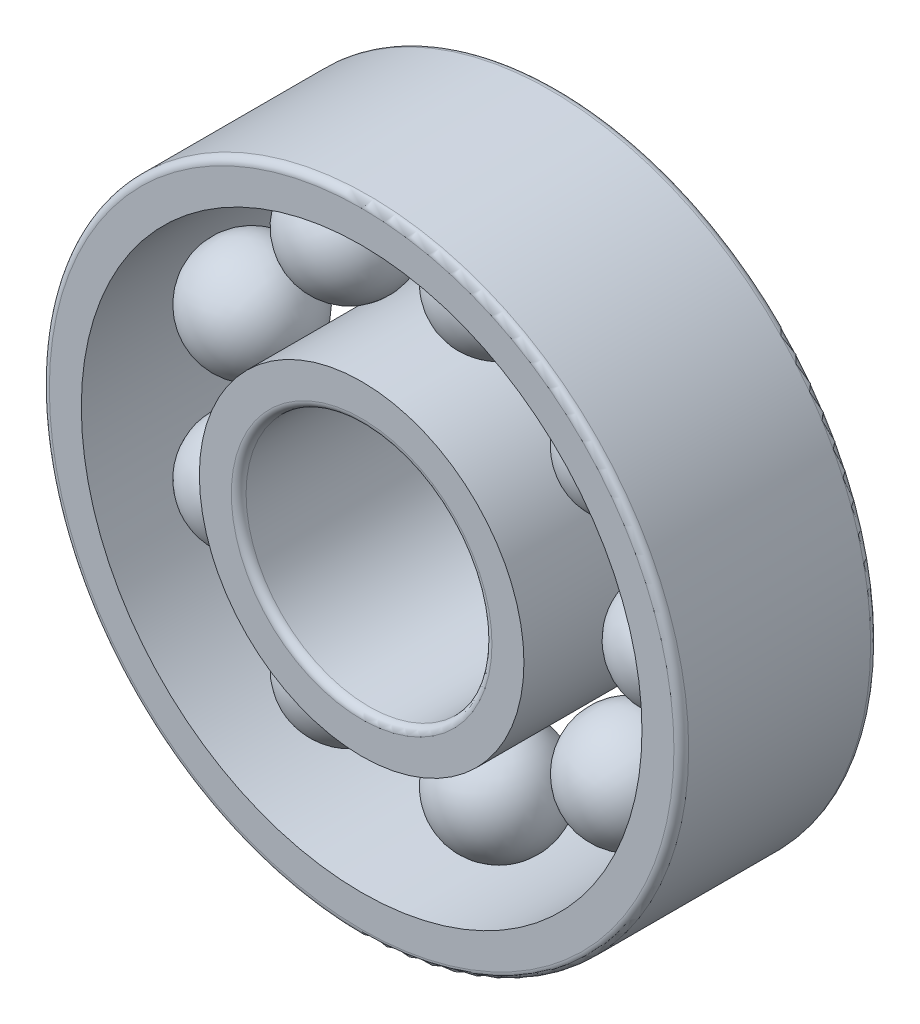
ISO-10303-21;
HEADER;
FILE_DESCRIPTION(('STEP AP214'),'2;1');
FILE_NAME('part.step','',(''),(''),'','','');
FILE_SCHEMA(('AUTOMOTIVE_DESIGN { 1 0 10303 214 1 1 1 1 }'));
ENDSEC;
DATA;
#1=APPLICATION_CONTEXT('core data for automotive mechanical design processes');
#2=APPLICATION_PROTOCOL_DEFINITION('international standard','automotive_design',2000,#1);
#3=PRODUCT_CONTEXT('',#1,'mechanical');
#4=PRODUCT('Part','Part','',(#3));
#5=PRODUCT_RELATED_PRODUCT_CATEGORY('part','',(#4));
#6=PRODUCT_DEFINITION_FORMATION('','',#4);
#7=PRODUCT_DEFINITION_CONTEXT('part definition',#1,'design');
#8=PRODUCT_DEFINITION('design','',#6,#7);
#9=PRODUCT_DEFINITION_SHAPE('','',#8);
#10=(LENGTH_UNIT() NAMED_UNIT(*) SI_UNIT(.MILLI.,.METRE.));
#11=(NAMED_UNIT(*) PLANE_ANGLE_UNIT() SI_UNIT($,.RADIAN.));
#12=(NAMED_UNIT(*) SI_UNIT($,.STERADIAN.) SOLID_ANGLE_UNIT());
#13=UNCERTAINTY_MEASURE_WITH_UNIT(LENGTH_MEASURE(1.E-05),#10,'distance_accuracy_value','');
#14=(GEOMETRIC_REPRESENTATION_CONTEXT(3) GLOBAL_UNCERTAINTY_ASSIGNED_CONTEXT((#13)) GLOBAL_UNIT_ASSIGNED_CONTEXT((#10,
#11,#12)) REPRESENTATION_CONTEXT('',''));
#15=CARTESIAN_POINT('',(0.,0.,0.));
#16=DIRECTION('',(0.,0.,1.));
#17=DIRECTION('',(1.,0.,0.));
#18=AXIS2_PLACEMENT_3D('',#15,#16,#17);
#19=CARTESIAN_POINT('',(6.8943999880708,-5.78508848717886,0.));
#20=DIRECTION('',(-0.766044443118978,0.64278760968654,0.));
#21=DIRECTION('',(0.,0.,-1.));
#22=AXIS2_PLACEMENT_3D('',#19,#20,#21);
#23=SPHERICAL_SURFACE('',#22,2.28);
#24=CARTESIAN_POINT('',(5.14781865775953,-4.31953273709355,0.));
#25=VERTEX_POINT('',#24);
#26=VERTEX_LOOP('',#25);
#27=FACE_BOUND('',#26,.T.);
#28=ADVANCED_FACE('F38',(#27),#23,.T.);
#29=CLOSED_SHELL('',(#28));
#30=MANIFOLD_SOLID_BREP('B2',#29);
#31=CARTESIAN_POINT('',(1.56283359900237,-8.86326977710987,0.));
#32=DIRECTION('',(-0.17364817766693,0.984807753012208,0.));
#33=DIRECTION('',(0.,0.,-1.));
#34=AXIS2_PLACEMENT_3D('',#31,#32,#33);
#35=SPHERICAL_SURFACE('',#34,2.28);
#36=CARTESIAN_POINT('',(1.16691575392177,-6.61790810024204,0.));
#37=VERTEX_POINT('',#36);
#38=VERTEX_LOOP('',#37);
#39=FACE_BOUND('',#38,.T.);
#40=ADVANCED_FACE('F57',(#39),#35,.T.);
#41=CLOSED_SHELL('',(#40));
#42=MANIFOLD_SOLID_BREP('B6',#41);
#43=CARTESIAN_POINT('',(-4.5,-7.79422863405995,0.));
#44=DIRECTION('',(0.5,0.866025403784438,0.));
#45=DIRECTION('',(0.,0.,-1.));
#46=AXIS2_PLACEMENT_3D('',#43,#44,#45);
#47=SPHERICAL_SURFACE('',#46,2.28);
#48=CARTESIAN_POINT('',(-3.36,-5.81969071343143,0.));
#49=VERTEX_POINT('',#48);
#50=VERTEX_LOOP('',#49);
#51=FACE_BOUND('',#50,.T.);
#52=ADVANCED_FACE('F76',(#51),#47,.T.);
#53=CLOSED_SHELL('',(#52));
#54=MANIFOLD_SOLID_BREP('B34',#53);
#55=CARTESIAN_POINT('',(-8.45723358707318,-3.07818128993102,0.));
#56=DIRECTION('',(0.939692620785908,0.342020143325669,0.));
#57=DIRECTION('',(0.,0.,-1.));
#58=AXIS2_PLACEMENT_3D('',#55,#56,#57);
#59=SPHERICAL_SURFACE('',#58,2.28);
#60=CARTESIAN_POINT('',(-6.3147344116813,-2.29837536314849,0.));
#61=VERTEX_POINT('',#60);
#62=VERTEX_LOOP('',#61);
#63=FACE_BOUND('',#62,.T.);
#64=ADVANCED_FACE('F95',(#63),#59,.T.);
#65=CLOSED_SHELL('',(#64));
#66=MANIFOLD_SOLID_BREP('B53',#65);
#67=CARTESIAN_POINT('',(-8.45723358707318,3.07818128993102,0.));
#68=DIRECTION('',(0.939692620785909,-0.342020143325669,0.));
#69=DIRECTION('',(0.,0.,-1.));
#70=AXIS2_PLACEMENT_3D('',#67,#68,#69);
#71=SPHERICAL_SURFACE('',#70,2.28);
#72=CARTESIAN_POINT('',(-6.31473441168131,2.2983753631485,0.));
#73=VERTEX_POINT('',#72);
#74=VERTEX_LOOP('',#73);
#75=FACE_BOUND('',#74,.T.);
#76=ADVANCED_FACE('F114',(#75),#71,.T.);
#77=CLOSED_SHELL('',(#76));
#78=MANIFOLD_SOLID_BREP('B72',#77);
#79=CARTESIAN_POINT('',(-4.5,7.79422863405995,0.));
#80=DIRECTION('',(0.5,-0.866025403784439,0.));
#81=DIRECTION('',(0.,0.,-1.));
#82=AXIS2_PLACEMENT_3D('',#79,#80,#81);
#83=SPHERICAL_SURFACE('',#82,2.28);
#84=CARTESIAN_POINT('',(-3.36,5.81969071343143,0.));
#85=VERTEX_POINT('',#84);
#86=VERTEX_LOOP('',#85);
#87=FACE_BOUND('',#86,.T.);
#88=ADVANCED_FACE('F133',(#87),#83,.T.);
#89=CLOSED_SHELL('',(#88));
#90=MANIFOLD_SOLID_BREP('B91',#89);
#91=CARTESIAN_POINT('',(1.56283359900237,8.86326977710987,0.));
#92=DIRECTION('',(-0.17364817766693,-0.984807753012208,0.));
#93=DIRECTION('',(0.,0.,-1.));
#94=AXIS2_PLACEMENT_3D('',#91,#92,#93);
#95=SPHERICAL_SURFACE('',#94,2.28);
#96=CARTESIAN_POINT('',(1.16691575392177,6.61790810024204,0.));
#97=VERTEX_POINT('',#96);
#98=VERTEX_LOOP('',#97);
#99=FACE_BOUND('',#98,.T.);
#100=ADVANCED_FACE('F152',(#99),#95,.T.);
#101=CLOSED_SHELL('',(#100));
#102=MANIFOLD_SOLID_BREP('B110',#101);
#103=CARTESIAN_POINT('',(6.8943999880708,5.78508848717886,0.));
#104=DIRECTION('',(-0.766044443118978,-0.642787609686539,0.));
#105=DIRECTION('',(0.,0.,-1.));
#106=AXIS2_PLACEMENT_3D('',#103,#104,#105);
#107=SPHERICAL_SURFACE('',#106,2.28);
#108=CARTESIAN_POINT('',(5.14781865775953,4.31953273709355,0.));
#109=VERTEX_POINT('',#108);
#110=VERTEX_LOOP('',#109);
#111=FACE_BOUND('',#110,.T.);
#112=ADVANCED_FACE('F171',(#111),#107,.T.);
#113=CLOSED_SHELL('',(#112));
#114=MANIFOLD_SOLID_BREP('B129',#113);
#115=CARTESIAN_POINT('',(9.,0.,0.));
#116=DIRECTION('',(-1.,0.,0.));
#117=DIRECTION('',(0.,0.,-1.));
#118=AXIS2_PLACEMENT_3D('',#115,#116,#117);
#119=SPHERICAL_SURFACE('',#118,2.28);
#120=CARTESIAN_POINT('',(6.72,0.,0.));
#121=VERTEX_POINT('',#120);
#122=VERTEX_LOOP('',#121);
#123=FACE_BOUND('',#122,.T.);
#124=ADVANCED_FACE('F192',(#123),#119,.T.);
#125=CLOSED_SHELL('',(#124));
#126=MANIFOLD_SOLID_BREP('B148',#125);
#127=CARTESIAN_POINT('',(0.,0.,7.));
#128=DIRECTION('',(0.,0.,1.));
#129=DIRECTION('',(1.,0.,0.));
#130=AXIS2_PLACEMENT_3D('',#127,#128,#129);
#131=CYLINDRICAL_SURFACE('',#130,11.4);
#132=CARTESIAN_POINT('',(0.,0.,4.));
#133=DIRECTION('',(0.,0.,1.));
#134=DIRECTION('',(1.,0.,0.));
#135=AXIS2_PLACEMENT_3D('',#132,#133,#134);
#136=CIRCLE('',#135,11.4);
#137=CARTESIAN_POINT('',(11.4,0.,4.));
#138=VERTEX_POINT('',#137);
#139=EDGE_CURVE('E232',#138,#138,#136,.T.);
#140=ORIENTED_EDGE('',*,*,#139,.T.);
#141=EDGE_LOOP('',(#140));
#142=FACE_BOUND('',#141,.T.);
#143=CARTESIAN_POINT('',(0.,0.,-4.));
#144=DIRECTION('',(0.,0.,1.));
#145=DIRECTION('',(1.,0.,0.));
#146=AXIS2_PLACEMENT_3D('',#143,#144,#145);
#147=CIRCLE('',#146,11.4);
#148=CARTESIAN_POINT('',(11.4,0.,-4.));
#149=VERTEX_POINT('',#148);
#150=EDGE_CURVE('E235',#149,#149,#147,.T.);
#151=ORIENTED_EDGE('',*,*,#150,.F.);
#152=EDGE_LOOP('',(#151));
#153=FACE_BOUND('',#152,.T.);
#154=ADVANCED_FACE('F212',(#142,#153),#131,.F.);
#155=CARTESIAN_POINT('',(11.4,0.,4.));
#156=DIRECTION('',(0.,0.,1.));
#157=DIRECTION('',(1.,0.,0.));
#158=AXIS2_PLACEMENT_3D('',#155,#156,#157);
#159=PLANE('',#158);
#160=CARTESIAN_POINT('',(0.,0.,4.));
#161=DIRECTION('',(0.,0.,1.));
#162=DIRECTION('',(1.,0.,0.));
#163=AXIS2_PLACEMENT_3D('',#160,#161,#162);
#164=CIRCLE('',#163,12.7);
#165=CARTESIAN_POINT('',(12.7,0.,4.));
#166=VERTEX_POINT('',#165);
#167=EDGE_CURVE('E191',#166,#166,#164,.T.);
#168=ORIENTED_EDGE('',*,*,#167,.T.);
#169=EDGE_LOOP('',(#168));
#170=FACE_BOUND('',#169,.T.);
#171=ORIENTED_EDGE('',*,*,#139,.F.);
#172=EDGE_LOOP('',(#171));
#173=FACE_BOUND('',#172,.T.);
#174=ADVANCED_FACE('F242',(#170,#173),#159,.T.);
#175=CARTESIAN_POINT('',(0.,0.,7.));
#176=DIRECTION('',(0.,0.,1.));
#177=DIRECTION('',(1.,0.,0.));
#178=AXIS2_PLACEMENT_3D('',#175,#176,#177);
#179=CYLINDRICAL_SURFACE('',#178,13.);
#180=CARTESIAN_POINT('',(0.,0.,-3.7));
#181=DIRECTION('',(0.,0.,-1.));
#182=DIRECTION('',(-1.,0.,0.));
#183=AXIS2_PLACEMENT_3D('',#180,#181,#182);
#184=CIRCLE('',#183,13.);
#185=CARTESIAN_POINT('',(-13.,0.,-3.7));
#186=VERTEX_POINT('',#185);
#187=EDGE_CURVE('E223',#186,#186,#184,.F.);
#188=ORIENTED_EDGE('',*,*,#187,.T.);
#189=EDGE_LOOP('',(#188));
#190=FACE_BOUND('',#189,.T.);
#191=CARTESIAN_POINT('',(0.,0.,3.7));
#192=DIRECTION('',(0.,0.,1.));
#193=DIRECTION('',(1.,0.,0.));
#194=AXIS2_PLACEMENT_3D('',#191,#192,#193);
#195=CIRCLE('',#194,13.);
#196=CARTESIAN_POINT('',(13.,0.,3.7));
#197=VERTEX_POINT('',#196);
#198=EDGE_CURVE('E227',#197,#197,#195,.F.);
#199=ORIENTED_EDGE('',*,*,#198,.T.);
#200=EDGE_LOOP('',(#199));
#201=FACE_BOUND('',#200,.T.);
#202=ADVANCED_FACE('F248',(#190,#201),#179,.T.);
#203=CARTESIAN_POINT('',(13.,0.,-4.));
#204=DIRECTION('',(0.,0.,-1.));
#205=DIRECTION('',(-1.,0.,0.));
#206=AXIS2_PLACEMENT_3D('',#203,#204,#205);
#207=PLANE('',#206);
#208=CARTESIAN_POINT('',(0.,0.,-4.));
#209=DIRECTION('',(0.,0.,-1.));
#210=DIRECTION('',(-1.,0.,0.));
#211=AXIS2_PLACEMENT_3D('',#208,#209,#210);
#212=CIRCLE('',#211,12.7);
#213=CARTESIAN_POINT('',(-12.7,0.,-4.));
#214=VERTEX_POINT('',#213);
#215=EDGE_CURVE('E219',#214,#214,#212,.T.);
#216=ORIENTED_EDGE('',*,*,#215,.T.);
#217=EDGE_LOOP('',(#216));
#218=FACE_BOUND('',#217,.T.);
#219=ORIENTED_EDGE('',*,*,#150,.T.);
#220=EDGE_LOOP('',(#219));
#221=FACE_BOUND('',#220,.T.);
#222=ADVANCED_FACE('F239',(#218,#221),#207,.T.);
#223=CARTESIAN_POINT('',(0.,0.,-3.7));
#224=DIRECTION('',(0.,0.,-1.));
#225=DIRECTION('',(-1.,0.,0.));
#226=AXIS2_PLACEMENT_3D('',#223,#224,#225);
#227=TOROIDAL_SURFACE('',#226,12.7,0.3);
#228=ORIENTED_EDGE('',*,*,#215,.F.);
#229=EDGE_LOOP('',(#228));
#230=FACE_BOUND('',#229,.T.);
#231=ORIENTED_EDGE('',*,*,#187,.F.);
#232=EDGE_LOOP('',(#231));
#233=FACE_BOUND('',#232,.T.);
#234=ADVANCED_FACE('F251',(#230,#233),#227,.T.);
#235=CARTESIAN_POINT('',(0.,0.,3.7));
#236=DIRECTION('',(0.,0.,1.));
#237=DIRECTION('',(1.,0.,0.));
#238=AXIS2_PLACEMENT_3D('',#235,#236,#237);
#239=TOROIDAL_SURFACE('',#238,12.7,0.3);
#240=ORIENTED_EDGE('',*,*,#198,.F.);
#241=EDGE_LOOP('',(#240));
#242=FACE_BOUND('',#241,.T.);
#243=ORIENTED_EDGE('',*,*,#167,.F.);
#244=EDGE_LOOP('',(#243));
#245=FACE_BOUND('',#244,.T.);
#246=ADVANCED_FACE('F214',(#242,#245),#239,.T.);
#247=CLOSED_SHELL('',(#154,#174,#202,#222,#234,#246));
#248=MANIFOLD_SOLID_BREP('B167',#247);
#249=CARTESIAN_POINT('',(0.,0.,7.));
#250=DIRECTION('',(0.,0.,1.));
#251=DIRECTION('',(1.,0.,0.));
#252=AXIS2_PLACEMENT_3D('',#249,#250,#251);
#253=CYLINDRICAL_SURFACE('',#252,5.);
#254=CARTESIAN_POINT('',(0.,0.,-3.7));
#255=DIRECTION('',(0.,0.,-1.));
#256=DIRECTION('',(-1.,0.,0.));
#257=AXIS2_PLACEMENT_3D('',#254,#255,#256);
#258=CIRCLE('',#257,5.);
#259=CARTESIAN_POINT('',(-5.,0.,-3.7));
#260=VERTEX_POINT('',#259);
#261=EDGE_CURVE('E311',#260,#260,#258,.T.);
#262=ORIENTED_EDGE('',*,*,#261,.T.);
#263=EDGE_LOOP('',(#262));
#264=FACE_BOUND('',#263,.T.);
#265=CARTESIAN_POINT('',(0.,0.,3.7));
#266=DIRECTION('',(0.,0.,1.));
#267=DIRECTION('',(1.,0.,0.));
#268=AXIS2_PLACEMENT_3D('',#265,#266,#267);
#269=CIRCLE('',#268,5.);
#270=CARTESIAN_POINT('',(5.,0.,3.7));
#271=VERTEX_POINT('',#270);
#272=EDGE_CURVE('E315',#271,#271,#269,.T.);
#273=ORIENTED_EDGE('',*,*,#272,.T.);
#274=EDGE_LOOP('',(#273));
#275=FACE_BOUND('',#274,.T.);
#276=ADVANCED_FACE('F304',(#264,#275),#253,.F.);
#277=CARTESIAN_POINT('',(5.,0.,4.));
#278=DIRECTION('',(0.,0.,1.));
#279=DIRECTION('',(1.,0.,0.));
#280=AXIS2_PLACEMENT_3D('',#277,#278,#279);
#281=PLANE('',#280);
#282=CARTESIAN_POINT('',(0.,0.,4.));
#283=DIRECTION('',(0.,0.,1.));
#284=DIRECTION('',(1.,0.,0.));
#285=AXIS2_PLACEMENT_3D('',#282,#283,#284);
#286=CIRCLE('',#285,5.3);
#287=CARTESIAN_POINT('',(5.3,0.,4.));
#288=VERTEX_POINT('',#287);
#289=EDGE_CURVE('E211',#288,#288,#286,.F.);
#290=ORIENTED_EDGE('',*,*,#289,.T.);
#291=EDGE_LOOP('',(#290));
#292=FACE_BOUND('',#291,.T.);
#293=CARTESIAN_POINT('',(0.,0.,4.));
#294=DIRECTION('',(0.,0.,1.));
#295=DIRECTION('',(1.,0.,0.));
#296=AXIS2_PLACEMENT_3D('',#293,#294,#295);
#297=CIRCLE('',#296,6.6);
#298=CARTESIAN_POINT('',(6.6,0.,4.));
#299=VERTEX_POINT('',#298);
#300=EDGE_CURVE('E324',#299,#299,#297,.T.);
#301=ORIENTED_EDGE('',*,*,#300,.T.);
#302=EDGE_LOOP('',(#301));
#303=FACE_BOUND('',#302,.T.);
#304=ADVANCED_FACE('F344',(#292,#303),#281,.T.);
#305=CARTESIAN_POINT('',(0.,0.,7.));
#306=DIRECTION('',(0.,0.,1.));
#307=DIRECTION('',(1.,0.,0.));
#308=AXIS2_PLACEMENT_3D('',#305,#306,#307);
#309=CYLINDRICAL_SURFACE('',#308,6.6);
#310=CARTESIAN_POINT('',(0.,0.,-4.));
#311=DIRECTION('',(0.,0.,1.));
#312=DIRECTION('',(1.,0.,0.));
#313=AXIS2_PLACEMENT_3D('',#310,#311,#312);
#314=CIRCLE('',#313,6.6);
#315=CARTESIAN_POINT('',(6.6,0.,-4.));
#316=VERTEX_POINT('',#315);
#317=EDGE_CURVE('E327',#316,#316,#314,.T.);
#318=ORIENTED_EDGE('',*,*,#317,.T.);
#319=EDGE_LOOP('',(#318));
#320=FACE_BOUND('',#319,.T.);
#321=ORIENTED_EDGE('',*,*,#300,.F.);
#322=EDGE_LOOP('',(#321));
#323=FACE_BOUND('',#322,.T.);
#324=ADVANCED_FACE('F331',(#320,#323),#309,.T.);
#325=CARTESIAN_POINT('',(6.6,0.,-4.));
#326=DIRECTION('',(0.,0.,-1.));
#327=DIRECTION('',(-1.,0.,0.));
#328=AXIS2_PLACEMENT_3D('',#325,#326,#327);
#329=PLANE('',#328);
#330=CARTESIAN_POINT('',(0.,0.,-4.));
#331=DIRECTION('',(0.,0.,-1.));
#332=DIRECTION('',(-1.,0.,0.));
#333=AXIS2_PLACEMENT_3D('',#330,#331,#332);
#334=CIRCLE('',#333,5.3);
#335=CARTESIAN_POINT('',(-5.3,0.,-4.));
#336=VERTEX_POINT('',#335);
#337=EDGE_CURVE('E319',#336,#336,#334,.F.);
#338=ORIENTED_EDGE('',*,*,#337,.T.);
#339=EDGE_LOOP('',(#338));
#340=FACE_BOUND('',#339,.T.);
#341=ORIENTED_EDGE('',*,*,#317,.F.);
#342=EDGE_LOOP('',(#341));
#343=FACE_BOUND('',#342,.T.);
#344=ADVANCED_FACE('F334',(#340,#343),#329,.T.);
#345=CARTESIAN_POINT('',(0.,0.,-3.7));
#346=DIRECTION('',(0.,0.,-1.));
#347=DIRECTION('',(-1.,0.,0.));
#348=AXIS2_PLACEMENT_3D('',#345,#346,#347);
#349=TOROIDAL_SURFACE('',#348,5.3,0.3);
#350=ORIENTED_EDGE('',*,*,#261,.F.);
#351=EDGE_LOOP('',(#350));
#352=FACE_BOUND('',#351,.T.);
#353=ORIENTED_EDGE('',*,*,#337,.F.);
#354=EDGE_LOOP('',(#353));
#355=FACE_BOUND('',#354,.T.);
#356=ADVANCED_FACE('F336',(#352,#355),#349,.T.);
#357=CARTESIAN_POINT('',(0.,0.,3.7));
#358=DIRECTION('',(0.,0.,1.));
#359=DIRECTION('',(1.,0.,0.));
#360=AXIS2_PLACEMENT_3D('',#357,#358,#359);
#361=TOROIDAL_SURFACE('',#360,5.3,0.3);
#362=ORIENTED_EDGE('',*,*,#289,.F.);
#363=EDGE_LOOP('',(#362));
#364=FACE_BOUND('',#363,.T.);
#365=ORIENTED_EDGE('',*,*,#272,.F.);
#366=EDGE_LOOP('',(#365));
#367=FACE_BOUND('',#366,.T.);
#368=ADVANCED_FACE('F306',(#364,#367),#361,.T.);
#369=CLOSED_SHELL('',(#276,#304,#324,#344,#356,#368));
#370=MANIFOLD_SOLID_BREP('B186',#369);
#371=ADVANCED_BREP_SHAPE_REPRESENTATION('',(#18,#30,#42,#54,#66,#78,#90,#102,#114,#126,#248,
#370),#14);
#372=SHAPE_DEFINITION_REPRESENTATION(#9,#371);
ENDSEC;
END-ISO-10303-21;
